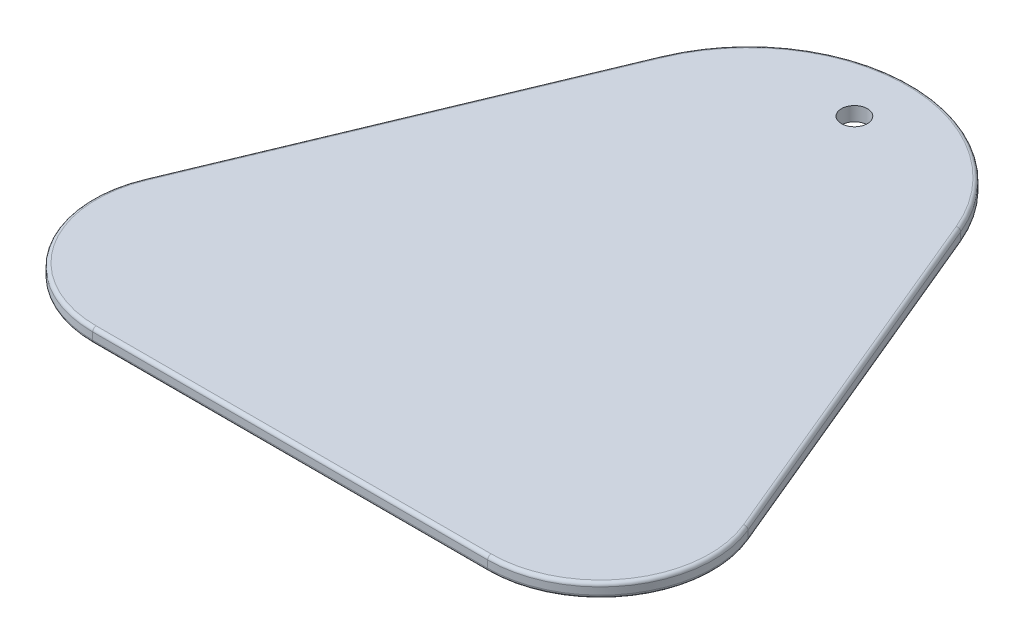
ISO-10303-21;
HEADER;
FILE_DESCRIPTION(('STEP AP214'),'2;1');
FILE_NAME('part.step','',(''),(''),'','','');
FILE_SCHEMA(('AUTOMOTIVE_DESIGN { 1 0 10303 214 1 1 1 1 }'));
ENDSEC;
DATA;
#1=APPLICATION_CONTEXT('core data for automotive mechanical design processes');
#2=APPLICATION_PROTOCOL_DEFINITION('international standard','automotive_design',2000,#1);
#3=PRODUCT_CONTEXT('',#1,'mechanical');
#4=PRODUCT('Part','Part','',(#3));
#5=PRODUCT_RELATED_PRODUCT_CATEGORY('part','',(#4));
#6=PRODUCT_DEFINITION_FORMATION('','',#4);
#7=PRODUCT_DEFINITION_CONTEXT('part definition',#1,'design');
#8=PRODUCT_DEFINITION('design','',#6,#7);
#9=PRODUCT_DEFINITION_SHAPE('','',#8);
#10=(LENGTH_UNIT() NAMED_UNIT(*) SI_UNIT(.MILLI.,.METRE.));
#11=(NAMED_UNIT(*) PLANE_ANGLE_UNIT() SI_UNIT($,.RADIAN.));
#12=(NAMED_UNIT(*) SI_UNIT($,.STERADIAN.) SOLID_ANGLE_UNIT());
#13=UNCERTAINTY_MEASURE_WITH_UNIT(LENGTH_MEASURE(1.E-05),#10,'distance_accuracy_value','');
#14=(GEOMETRIC_REPRESENTATION_CONTEXT(3) GLOBAL_UNCERTAINTY_ASSIGNED_CONTEXT((#13)) GLOBAL_UNIT_ASSIGNED_CONTEXT((#10,
#11,#12)) REPRESENTATION_CONTEXT('',''));
#15=CARTESIAN_POINT('',(0.,0.,0.));
#16=DIRECTION('',(0.,0.,1.));
#17=DIRECTION('',(1.,0.,0.));
#18=AXIS2_PLACEMENT_3D('',#15,#16,#17);
#19=CARTESIAN_POINT('',(0.,12.7,-311.15));
#20=DIRECTION('',(0.,1.,0.));
#21=DIRECTION('',(0.,0.,1.));
#22=AXIS2_PLACEMENT_3D('',#19,#20,#21);
#23=PLANE('',#22);
#24=DIRECTION('',(-0.384615384615384,0.,0.923076923076923));
#25=VECTOR('',#24,1.);
#26=CARTESIAN_POINT('',(-268.653846153846,12.7,-37.8557692307693));
#27=LINE('',#26,#25);
#28=CARTESIAN_POINT('',(-131.884615384615,12.7,-366.101923076923));
#29=VERTEX_POINT('',#28);
#30=CARTESIAN_POINT('',(-268.653846153846,12.7,-37.8557692307693));
#31=VERTEX_POINT('',#30);
#32=EDGE_CURVE('E152',#29,#31,#27,.T.);
#33=ORIENTED_EDGE('',*,*,#32,.T.);
#34=CARTESIAN_POINT('',(-177.8,12.7,0.));
#35=DIRECTION('',(0.,1.,0.));
#36=DIRECTION('',(0.,0.,1.));
#37=AXIS2_PLACEMENT_3D('',#34,#35,#36);
#38=CIRCLE('',#37,98.425);
#39=CARTESIAN_POINT('',(-177.8,12.7,98.425));
#40=VERTEX_POINT('',#39);
#41=EDGE_CURVE('E133',#31,#40,#38,.T.);
#42=ORIENTED_EDGE('',*,*,#41,.T.);
#43=DIRECTION('',(1.,0.,0.));
#44=VECTOR('',#43,1.);
#45=CARTESIAN_POINT('',(177.8,12.7,98.425));
#46=LINE('',#45,#44);
#47=CARTESIAN_POINT('',(177.8,12.7,98.425));
#48=VERTEX_POINT('',#47);
#49=EDGE_CURVE('E141',#40,#48,#46,.T.);
#50=ORIENTED_EDGE('',*,*,#49,.T.);
#51=CARTESIAN_POINT('',(177.8,12.7,0.));
#52=DIRECTION('',(0.,1.,0.));
#53=DIRECTION('',(0.,0.,1.));
#54=AXIS2_PLACEMENT_3D('',#51,#52,#53);
#55=CIRCLE('',#54,98.425);
#56=CARTESIAN_POINT('',(268.653846153846,12.7,-37.8557692307692));
#57=VERTEX_POINT('',#56);
#58=EDGE_CURVE('E147',#48,#57,#55,.T.);
#59=ORIENTED_EDGE('',*,*,#58,.T.);
#60=DIRECTION('',(-0.384615384615385,0.,-0.923076923076923));
#61=VECTOR('',#60,1.);
#62=CARTESIAN_POINT('',(131.884615384615,12.7,-366.101923076923));
#63=LINE('',#62,#61);
#64=CARTESIAN_POINT('',(131.884615384615,12.7,-366.101923076923));
#65=VERTEX_POINT('',#64);
#66=EDGE_CURVE('E258',#57,#65,#63,.T.);
#67=ORIENTED_EDGE('',*,*,#66,.T.);
#68=CARTESIAN_POINT('',(0.,12.7,-311.15));
#69=DIRECTION('',(0.,1.,0.));
#70=DIRECTION('',(0.,0.,1.));
#71=AXIS2_PLACEMENT_3D('',#68,#69,#70);
#72=CIRCLE('',#71,142.875);
#73=EDGE_CURVE('E157',#65,#29,#72,.T.);
#74=ORIENTED_EDGE('',*,*,#73,.T.);
#75=EDGE_LOOP('',(#33,#42,#50,#59,#67,#74));
#76=FACE_BOUND('',#75,.T.);
#77=CARTESIAN_POINT('',(0.,12.7,-406.4));
#78=DIRECTION('',(0.,1.,0.));
#79=DIRECTION('',(0.,0.,1.));
#80=AXIS2_PLACEMENT_3D('',#77,#78,#79);
#81=CIRCLE('',#80,11.7094);
#82=CARTESIAN_POINT('',(0.,12.7,-394.6906));
#83=VERTEX_POINT('',#82);
#84=EDGE_CURVE('E277',#83,#83,#81,.T.);
#85=ORIENTED_EDGE('',*,*,#84,.F.);
#86=EDGE_LOOP('',(#85));
#87=FACE_BOUND('',#86,.T.);
#88=ADVANCED_FACE('F37',(#76,#87),#23,.T.);
#89=CARTESIAN_POINT('',(0.,0.,-311.15));
#90=DIRECTION('',(0.,1.,0.));
#91=DIRECTION('',(0.,0.,1.));
#92=AXIS2_PLACEMENT_3D('',#89,#90,#91);
#93=PLANE('',#92);
#94=DIRECTION('',(1.,0.,0.));
#95=VECTOR('',#94,1.);
#96=CARTESIAN_POINT('',(0.,0.,98.425));
#97=LINE('',#96,#95);
#98=CARTESIAN_POINT('',(177.8,0.,98.425));
#99=VERTEX_POINT('',#98);
#100=CARTESIAN_POINT('',(-177.8,0.,98.425));
#101=VERTEX_POINT('',#100);
#102=EDGE_CURVE('E185',#99,#101,#97,.F.);
#103=ORIENTED_EDGE('',*,*,#102,.T.);
#104=CARTESIAN_POINT('',(-177.8,0.,0.));
#105=DIRECTION('',(0.,1.,0.));
#106=DIRECTION('',(0.,0.,1.));
#107=AXIS2_PLACEMENT_3D('',#104,#105,#106);
#108=CIRCLE('',#107,98.425);
#109=CARTESIAN_POINT('',(-268.653846153846,0.,-37.8557692307693));
#110=VERTEX_POINT('',#109);
#111=EDGE_CURVE('E195',#101,#110,#108,.F.);
#112=ORIENTED_EDGE('',*,*,#111,.T.);
#113=DIRECTION('',(-0.384615384615384,0.,0.923076923076923));
#114=VECTOR('',#113,1.);
#115=CARTESIAN_POINT('',(-131.884615384615,0.,-366.101923076923));
#116=LINE('',#115,#114);
#117=CARTESIAN_POINT('',(-131.884615384615,0.,-366.101923076923));
#118=VERTEX_POINT('',#117);
#119=EDGE_CURVE('E193',#110,#118,#116,.F.);
#120=ORIENTED_EDGE('',*,*,#119,.T.);
#121=CARTESIAN_POINT('',(0.,0.,-311.15));
#122=DIRECTION('',(0.,1.,0.));
#123=DIRECTION('',(0.,0.,1.));
#124=AXIS2_PLACEMENT_3D('',#121,#122,#123);
#125=CIRCLE('',#124,142.875);
#126=CARTESIAN_POINT('',(131.884615384615,0.,-366.101923076923));
#127=VERTEX_POINT('',#126);
#128=EDGE_CURVE('E191',#118,#127,#125,.F.);
#129=ORIENTED_EDGE('',*,*,#128,.T.);
#130=DIRECTION('',(-0.384615384615385,0.,-0.923076923076923));
#131=VECTOR('',#130,1.);
#132=CARTESIAN_POINT('',(131.884615384615,0.,-366.101923076923));
#133=LINE('',#132,#131);
#134=CARTESIAN_POINT('',(268.653846153846,0.,-37.8557692307692));
#135=VERTEX_POINT('',#134);
#136=EDGE_CURVE('E189',#127,#135,#133,.F.);
#137=ORIENTED_EDGE('',*,*,#136,.T.);
#138=CARTESIAN_POINT('',(177.8,0.,0.));
#139=DIRECTION('',(0.,1.,0.));
#140=DIRECTION('',(0.,0.,1.));
#141=AXIS2_PLACEMENT_3D('',#138,#139,#140);
#142=CIRCLE('',#141,98.425);
#143=EDGE_CURVE('E187',#135,#99,#142,.F.);
#144=ORIENTED_EDGE('',*,*,#143,.T.);
#145=EDGE_LOOP('',(#103,#112,#120,#129,#137,#144));
#146=FACE_BOUND('',#145,.T.);
#147=CARTESIAN_POINT('',(0.,0.,-406.4));
#148=DIRECTION('',(0.,1.,0.));
#149=DIRECTION('',(0.,0.,1.));
#150=AXIS2_PLACEMENT_3D('',#147,#148,#149);
#151=CIRCLE('',#150,11.7094);
#152=CARTESIAN_POINT('',(0.,0.,-394.6906));
#153=VERTEX_POINT('',#152);
#154=EDGE_CURVE('E182',#153,#153,#151,.T.);
#155=ORIENTED_EDGE('',*,*,#154,.T.);
#156=EDGE_LOOP('',(#155));
#157=FACE_BOUND('',#156,.T.);
#158=ADVANCED_FACE('F230',(#146,#157),#93,.F.);
#159=CARTESIAN_POINT('',(0.,12.7,-311.15));
#160=DIRECTION('',(0.,-1.,0.));
#161=DIRECTION('',(0.,0.,-1.));
#162=AXIS2_PLACEMENT_3D('',#159,#160,#161);
#163=CYLINDRICAL_SURFACE('',#162,146.05);
#164=DIRECTION('',(0.,-1.,0.));
#165=VECTOR('',#164,1.);
#166=CARTESIAN_POINT('',(134.815384615385,12.7,-367.323076923077));
#167=LINE('',#166,#165);
#168=CARTESIAN_POINT('',(134.815384615385,9.525,-367.323076923077));
#169=VERTEX_POINT('',#168);
#170=CARTESIAN_POINT('',(134.815384615385,3.175,-367.323076923077));
#171=VERTEX_POINT('',#170);
#172=EDGE_CURVE('E273',#169,#171,#167,.T.);
#173=ORIENTED_EDGE('',*,*,#172,.T.);
#174=CARTESIAN_POINT('',(0.,3.175,-311.15));
#175=DIRECTION('',(0.,1.,0.));
#176=DIRECTION('',(0.,0.,1.));
#177=AXIS2_PLACEMENT_3D('',#174,#175,#176);
#178=CIRCLE('',#177,146.05);
#179=CARTESIAN_POINT('',(-134.815384615385,3.175,-367.323076923077));
#180=VERTEX_POINT('',#179);
#181=EDGE_CURVE('E200',#171,#180,#178,.T.);
#182=ORIENTED_EDGE('',*,*,#181,.T.);
#183=DIRECTION('',(0.,-1.,0.));
#184=VECTOR('',#183,1.);
#185=CARTESIAN_POINT('',(-134.815384615385,12.7,-367.323076923077));
#186=LINE('',#185,#184);
#187=CARTESIAN_POINT('',(-134.815384615385,9.525,-367.323076923077));
#188=VERTEX_POINT('',#187);
#189=EDGE_CURVE('E148',#188,#180,#186,.T.);
#190=ORIENTED_EDGE('',*,*,#189,.F.);
#191=CARTESIAN_POINT('',(0.,9.525,-311.15));
#192=DIRECTION('',(0.,1.,0.));
#193=DIRECTION('',(0.,0.,1.));
#194=AXIS2_PLACEMENT_3D('',#191,#192,#193);
#195=CIRCLE('',#194,146.05);
#196=EDGE_CURVE('E162',#188,#169,#195,.F.);
#197=ORIENTED_EDGE('',*,*,#196,.T.);
#198=EDGE_LOOP('',(#173,#182,#190,#197));
#199=FACE_BOUND('',#198,.T.);
#200=ADVANCED_FACE('F271',(#199),#163,.T.);
#201=CARTESIAN_POINT('',(-134.815384615385,12.7,-367.323076923077));
#202=DIRECTION('',(0.923076923076923,0.,0.384615384615384));
#203=DIRECTION('',(0.384615384615384,0.,-0.923076923076923));
#204=AXIS2_PLACEMENT_3D('',#201,#202,#203);
#205=PLANE('',#204);
#206=ORIENTED_EDGE('',*,*,#189,.T.);
#207=DIRECTION('',(-0.384615384615384,0.,0.923076923076923));
#208=VECTOR('',#207,1.);
#209=CARTESIAN_POINT('',(-134.815384615385,3.175,-367.323076923077));
#210=LINE('',#209,#208);
#211=CARTESIAN_POINT('',(-271.584615384615,3.175,-39.0769230769231));
#212=VERTEX_POINT('',#211);
#213=EDGE_CURVE('E198',#180,#212,#210,.T.);
#214=ORIENTED_EDGE('',*,*,#213,.T.);
#215=DIRECTION('',(0.,-1.,0.));
#216=VECTOR('',#215,1.);
#217=CARTESIAN_POINT('',(-271.584615384615,12.7,-39.0769230769231));
#218=LINE('',#217,#216);
#219=CARTESIAN_POINT('',(-271.584615384615,9.525,-39.0769230769231));
#220=VERTEX_POINT('',#219);
#221=EDGE_CURVE('E245',#220,#212,#218,.T.);
#222=ORIENTED_EDGE('',*,*,#221,.F.);
#223=DIRECTION('',(-0.384615384615384,0.,0.923076923076923));
#224=VECTOR('',#223,1.);
#225=CARTESIAN_POINT('',(-134.815384615385,9.525,-367.323076923077));
#226=LINE('',#225,#224);
#227=EDGE_CURVE('E155',#220,#188,#226,.F.);
#228=ORIENTED_EDGE('',*,*,#227,.T.);
#229=EDGE_LOOP('',(#206,#214,#222,#228));
#230=FACE_BOUND('',#229,.T.);
#231=ADVANCED_FACE('F244',(#230),#205,.F.);
#232=CARTESIAN_POINT('',(-177.8,12.7,0.));
#233=DIRECTION('',(0.,-1.,0.));
#234=DIRECTION('',(0.,0.,-1.));
#235=AXIS2_PLACEMENT_3D('',#232,#233,#234);
#236=CYLINDRICAL_SURFACE('',#235,101.6);
#237=ORIENTED_EDGE('',*,*,#221,.T.);
#238=CARTESIAN_POINT('',(-177.8,3.175,0.));
#239=DIRECTION('',(0.,1.,0.));
#240=DIRECTION('',(0.,0.,1.));
#241=AXIS2_PLACEMENT_3D('',#238,#239,#240);
#242=CIRCLE('',#241,101.6);
#243=CARTESIAN_POINT('',(-177.8,3.175,101.6));
#244=VERTEX_POINT('',#243);
#245=EDGE_CURVE('E169',#212,#244,#242,.T.);
#246=ORIENTED_EDGE('',*,*,#245,.T.);
#247=DIRECTION('',(0.,-1.,0.));
#248=VECTOR('',#247,1.);
#249=CARTESIAN_POINT('',(-177.8,12.7,101.6));
#250=LINE('',#249,#248);
#251=CARTESIAN_POINT('',(-177.8,9.525,101.6));
#252=VERTEX_POINT('',#251);
#253=EDGE_CURVE('E250',#252,#244,#250,.T.);
#254=ORIENTED_EDGE('',*,*,#253,.F.);
#255=CARTESIAN_POINT('',(-177.8,9.525,0.));
#256=DIRECTION('',(0.,1.,0.));
#257=DIRECTION('',(0.,0.,1.));
#258=AXIS2_PLACEMENT_3D('',#255,#256,#257);
#259=CIRCLE('',#258,101.6);
#260=EDGE_CURVE('E135',#252,#220,#259,.F.);
#261=ORIENTED_EDGE('',*,*,#260,.T.);
#262=EDGE_LOOP('',(#237,#246,#254,#261));
#263=FACE_BOUND('',#262,.T.);
#264=ADVANCED_FACE('F248',(#263),#236,.T.);
#265=CARTESIAN_POINT('',(-177.8,12.7,101.6));
#266=DIRECTION('',(0.,0.,-1.));
#267=DIRECTION('',(-1.,0.,0.));
#268=AXIS2_PLACEMENT_3D('',#265,#266,#267);
#269=PLANE('',#268);
#270=ORIENTED_EDGE('',*,*,#253,.T.);
#271=DIRECTION('',(1.,0.,0.));
#272=VECTOR('',#271,1.);
#273=CARTESIAN_POINT('',(-177.8,3.175,101.6));
#274=LINE('',#273,#272);
#275=CARTESIAN_POINT('',(177.8,3.175,101.6));
#276=VERTEX_POINT('',#275);
#277=EDGE_CURVE('E11',#244,#276,#274,.T.);
#278=ORIENTED_EDGE('',*,*,#277,.T.);
#279=DIRECTION('',(0.,-1.,0.));
#280=VECTOR('',#279,1.);
#281=CARTESIAN_POINT('',(177.8,12.7,101.6));
#282=LINE('',#281,#280);
#283=CARTESIAN_POINT('',(177.8,9.525,101.6));
#284=VERTEX_POINT('',#283);
#285=EDGE_CURVE('E253',#284,#276,#282,.T.);
#286=ORIENTED_EDGE('',*,*,#285,.F.);
#287=DIRECTION('',(1.,0.,0.));
#288=VECTOR('',#287,1.);
#289=CARTESIAN_POINT('',(-177.8,9.525,101.6));
#290=LINE('',#289,#288);
#291=EDGE_CURVE('E168',#284,#252,#290,.F.);
#292=ORIENTED_EDGE('',*,*,#291,.T.);
#293=EDGE_LOOP('',(#270,#278,#286,#292));
#294=FACE_BOUND('',#293,.T.);
#295=ADVANCED_FACE('F313',(#294),#269,.F.);
#296=CARTESIAN_POINT('',(177.8,12.7,0.));
#297=DIRECTION('',(0.,-1.,0.));
#298=DIRECTION('',(0.,0.,-1.));
#299=AXIS2_PLACEMENT_3D('',#296,#297,#298);
#300=CYLINDRICAL_SURFACE('',#299,101.6);
#301=ORIENTED_EDGE('',*,*,#285,.T.);
#302=CARTESIAN_POINT('',(177.8,3.175,0.));
#303=DIRECTION('',(0.,1.,0.));
#304=DIRECTION('',(0.,0.,1.));
#305=AXIS2_PLACEMENT_3D('',#302,#303,#304);
#306=CIRCLE('',#305,101.6);
#307=CARTESIAN_POINT('',(271.584615384615,3.175,-39.0769230769231));
#308=VERTEX_POINT('',#307);
#309=EDGE_CURVE('E46',#276,#308,#306,.T.);
#310=ORIENTED_EDGE('',*,*,#309,.T.);
#311=DIRECTION('',(0.,-1.,0.));
#312=VECTOR('',#311,1.);
#313=CARTESIAN_POINT('',(271.584615384615,12.7,-39.0769230769231));
#314=LINE('',#313,#312);
#315=CARTESIAN_POINT('',(271.584615384615,9.525,-39.0769230769231));
#316=VERTEX_POINT('',#315);
#317=EDGE_CURVE('E276',#316,#308,#314,.T.);
#318=ORIENTED_EDGE('',*,*,#317,.F.);
#319=CARTESIAN_POINT('',(177.8,9.525,0.));
#320=DIRECTION('',(0.,1.,0.));
#321=DIRECTION('',(0.,0.,1.));
#322=AXIS2_PLACEMENT_3D('',#319,#320,#321);
#323=CIRCLE('',#322,101.6);
#324=EDGE_CURVE('E166',#316,#284,#323,.F.);
#325=ORIENTED_EDGE('',*,*,#324,.T.);
#326=EDGE_LOOP('',(#301,#310,#318,#325));
#327=FACE_BOUND('',#326,.T.);
#328=ADVANCED_FACE('F283',(#327),#300,.T.);
#329=CARTESIAN_POINT('',(134.815384615385,12.7,-367.323076923077));
#330=DIRECTION('',(-0.923076923076923,0.,0.384615384615385));
#331=DIRECTION('',(0.384615384615385,0.,0.923076923076923));
#332=AXIS2_PLACEMENT_3D('',#329,#330,#331);
#333=PLANE('',#332);
#334=ORIENTED_EDGE('',*,*,#317,.T.);
#335=DIRECTION('',(-0.384615384615385,0.,-0.923076923076923));
#336=VECTOR('',#335,1.);
#337=CARTESIAN_POINT('',(134.815384615385,3.175,-367.323076923077));
#338=LINE('',#337,#336);
#339=EDGE_CURVE('E202',#308,#171,#338,.T.);
#340=ORIENTED_EDGE('',*,*,#339,.T.);
#341=ORIENTED_EDGE('',*,*,#172,.F.);
#342=DIRECTION('',(-0.384615384615385,0.,-0.923076923076923));
#343=VECTOR('',#342,1.);
#344=CARTESIAN_POINT('',(271.584615384615,9.525,-39.0769230769231));
#345=LINE('',#344,#343);
#346=EDGE_CURVE('E164',#169,#316,#345,.F.);
#347=ORIENTED_EDGE('',*,*,#346,.T.);
#348=EDGE_LOOP('',(#334,#340,#341,#347));
#349=FACE_BOUND('',#348,.T.);
#350=ADVANCED_FACE('F308',(#349),#333,.F.);
#351=CARTESIAN_POINT('',(0.,12.7,-406.4));
#352=DIRECTION('',(0.,-1.,0.));
#353=DIRECTION('',(0.,0.,-1.));
#354=AXIS2_PLACEMENT_3D('',#351,#352,#353);
#355=CYLINDRICAL_SURFACE('',#354,11.7094);
#356=ORIENTED_EDGE('',*,*,#84,.T.);
#357=EDGE_LOOP('',(#356));
#358=FACE_BOUND('',#357,.T.);
#359=ORIENTED_EDGE('',*,*,#154,.F.);
#360=EDGE_LOOP('',(#359));
#361=FACE_BOUND('',#360,.T.);
#362=ADVANCED_FACE('F306',(#358,#361),#355,.F.);
#363=CARTESIAN_POINT('',(131.884615384615,9.525,-366.101923076923));
#364=DIRECTION('',(0.384615384615385,0.,0.923076923076923));
#365=DIRECTION('',(0.923076923076923,0.,-0.384615384615385));
#366=AXIS2_PLACEMENT_3D('',#363,#364,#365);
#367=CYLINDRICAL_SURFACE('',#366,3.175);
#368=CARTESIAN_POINT('',(268.653846153846,9.525,-37.8557692307692));
#369=DIRECTION('',(0.384615384615383,0.,0.923076923076924));
#370=DIRECTION('',(0.923076923076924,0.,-0.384615384615383));
#371=AXIS2_PLACEMENT_3D('',#368,#369,#370);
#372=CIRCLE('',#371,3.175);
#373=EDGE_CURVE('E176',#316,#57,#372,.T.);
#374=ORIENTED_EDGE('',*,*,#373,.F.);
#375=ORIENTED_EDGE('',*,*,#346,.F.);
#376=CARTESIAN_POINT('',(131.884615384615,9.525,-366.101923076923));
#377=DIRECTION('',(-0.384615384615383,0.,-0.923076923076924));
#378=DIRECTION('',(-0.923076923076924,0.,0.384615384615383));
#379=AXIS2_PLACEMENT_3D('',#376,#377,#378);
#380=CIRCLE('',#379,3.175);
#381=EDGE_CURVE('E179',#65,#169,#380,.T.);
#382=ORIENTED_EDGE('',*,*,#381,.F.);
#383=ORIENTED_EDGE('',*,*,#66,.F.);
#384=EDGE_LOOP('',(#374,#375,#382,#383));
#385=FACE_BOUND('',#384,.T.);
#386=ADVANCED_FACE('F333',(#385),#367,.T.);
#387=CARTESIAN_POINT('',(0.,9.525,-311.15));
#388=DIRECTION('',(0.,1.,0.));
#389=DIRECTION('',(0.,0.,1.));
#390=AXIS2_PLACEMENT_3D('',#387,#388,#389);
#391=TOROIDAL_SURFACE('',#390,142.875,3.175);
#392=ORIENTED_EDGE('',*,*,#381,.T.);
#393=ORIENTED_EDGE('',*,*,#196,.F.);
#394=CARTESIAN_POINT('',(-131.884615384615,9.525,-366.101923076923));
#395=DIRECTION('',(-0.384615384615377,0.,0.923076923076926));
#396=DIRECTION('',(0.923076923076926,0.,0.384615384615377));
#397=AXIS2_PLACEMENT_3D('',#394,#395,#396);
#398=CIRCLE('',#397,3.175);
#399=EDGE_CURVE('E173',#29,#188,#398,.T.);
#400=ORIENTED_EDGE('',*,*,#399,.F.);
#401=ORIENTED_EDGE('',*,*,#73,.F.);
#402=EDGE_LOOP('',(#392,#393,#400,#401));
#403=FACE_BOUND('',#402,.T.);
#404=ADVANCED_FACE('F265',(#403),#391,.T.);
#405=CARTESIAN_POINT('',(177.8,9.525,0.));
#406=DIRECTION('',(0.,1.,0.));
#407=DIRECTION('',(0.,0.,1.));
#408=AXIS2_PLACEMENT_3D('',#405,#406,#407);
#409=TOROIDAL_SURFACE('',#408,98.425,3.175);
#410=ORIENTED_EDGE('',*,*,#373,.T.);
#411=ORIENTED_EDGE('',*,*,#58,.F.);
#412=CARTESIAN_POINT('',(177.8,9.525,98.425));
#413=DIRECTION('',(-1.,0.,0.));
#414=DIRECTION('',(0.,0.,1.));
#415=AXIS2_PLACEMENT_3D('',#412,#413,#414);
#416=CIRCLE('',#415,3.175);
#417=EDGE_CURVE('E144',#284,#48,#416,.T.);
#418=ORIENTED_EDGE('',*,*,#417,.F.);
#419=ORIENTED_EDGE('',*,*,#324,.F.);
#420=EDGE_LOOP('',(#410,#411,#418,#419));
#421=FACE_BOUND('',#420,.T.);
#422=ADVANCED_FACE('F328',(#421),#409,.T.);
#423=CARTESIAN_POINT('',(-131.884615384615,9.525,-366.101923076923));
#424=DIRECTION('',(0.384615384615384,0.,-0.923076923076923));
#425=DIRECTION('',(-0.923076923076923,0.,-0.384615384615384));
#426=AXIS2_PLACEMENT_3D('',#423,#424,#425);
#427=CYLINDRICAL_SURFACE('',#426,3.175);
#428=ORIENTED_EDGE('',*,*,#399,.T.);
#429=ORIENTED_EDGE('',*,*,#227,.F.);
#430=CARTESIAN_POINT('',(-268.653846153846,9.525,-37.8557692307693));
#431=DIRECTION('',(-0.384615384615387,0.,0.923076923076922));
#432=DIRECTION('',(0.923076923076922,0.,0.384615384615387));
#433=AXIS2_PLACEMENT_3D('',#430,#431,#432);
#434=CIRCLE('',#433,3.175);
#435=EDGE_CURVE('E138',#31,#220,#434,.T.);
#436=ORIENTED_EDGE('',*,*,#435,.F.);
#437=ORIENTED_EDGE('',*,*,#32,.F.);
#438=EDGE_LOOP('',(#428,#429,#436,#437));
#439=FACE_BOUND('',#438,.T.);
#440=ADVANCED_FACE('F268',(#439),#427,.T.);
#441=CARTESIAN_POINT('',(0.,9.525,98.425));
#442=DIRECTION('',(-1.,0.,0.));
#443=DIRECTION('',(0.,0.,1.));
#444=AXIS2_PLACEMENT_3D('',#441,#442,#443);
#445=CYLINDRICAL_SURFACE('',#444,3.175);
#446=ORIENTED_EDGE('',*,*,#417,.T.);
#447=ORIENTED_EDGE('',*,*,#49,.F.);
#448=CARTESIAN_POINT('',(-177.8,9.525,98.425));
#449=DIRECTION('',(-1.,0.,0.));
#450=DIRECTION('',(0.,0.,1.));
#451=AXIS2_PLACEMENT_3D('',#448,#449,#450);
#452=CIRCLE('',#451,3.175);
#453=EDGE_CURVE('E129',#252,#40,#452,.T.);
#454=ORIENTED_EDGE('',*,*,#453,.F.);
#455=ORIENTED_EDGE('',*,*,#291,.F.);
#456=EDGE_LOOP('',(#446,#447,#454,#455));
#457=FACE_BOUND('',#456,.T.);
#458=ADVANCED_FACE('F142',(#457),#445,.T.);
#459=CARTESIAN_POINT('',(-177.8,9.525,0.));
#460=DIRECTION('',(0.,1.,0.));
#461=DIRECTION('',(0.,0.,1.));
#462=AXIS2_PLACEMENT_3D('',#459,#460,#461);
#463=TOROIDAL_SURFACE('',#462,98.425,3.175);
#464=ORIENTED_EDGE('',*,*,#435,.T.);
#465=ORIENTED_EDGE('',*,*,#260,.F.);
#466=ORIENTED_EDGE('',*,*,#453,.T.);
#467=ORIENTED_EDGE('',*,*,#41,.F.);
#468=EDGE_LOOP('',(#464,#465,#466,#467));
#469=FACE_BOUND('',#468,.T.);
#470=ADVANCED_FACE('F131',(#469),#463,.T.);
#471=CARTESIAN_POINT('',(131.884615384615,3.175,-366.101923076923));
#472=DIRECTION('',(-0.384615384615385,0.,-0.923076923076923));
#473=DIRECTION('',(-0.923076923076923,0.,0.384615384615385));
#474=AXIS2_PLACEMENT_3D('',#471,#472,#473);
#475=CYLINDRICAL_SURFACE('',#474,3.175);
#476=CARTESIAN_POINT('',(268.653846153846,3.175,-37.8557692307692));
#477=DIRECTION('',(0.384615384615385,0.,0.923076923076923));
#478=DIRECTION('',(0.923076923076923,0.,-0.384615384615385));
#479=AXIS2_PLACEMENT_3D('',#476,#477,#478);
#480=CIRCLE('',#479,3.175);
#481=EDGE_CURVE('E214',#135,#308,#480,.T.);
#482=ORIENTED_EDGE('',*,*,#481,.F.);
#483=ORIENTED_EDGE('',*,*,#136,.F.);
#484=CARTESIAN_POINT('',(131.884615384615,3.175,-366.101923076923));
#485=DIRECTION('',(-0.384615384615383,0.,-0.923076923076924));
#486=DIRECTION('',(-0.923076923076924,0.,0.384615384615383));
#487=AXIS2_PLACEMENT_3D('',#484,#485,#486);
#488=CIRCLE('',#487,3.175);
#489=EDGE_CURVE('E41',#171,#127,#488,.T.);
#490=ORIENTED_EDGE('',*,*,#489,.F.);
#491=ORIENTED_EDGE('',*,*,#339,.F.);
#492=EDGE_LOOP('',(#482,#483,#490,#491));
#493=FACE_BOUND('',#492,.T.);
#494=ADVANCED_FACE('F39',(#493),#475,.T.);
#495=CARTESIAN_POINT('',(0.,3.175,-311.15));
#496=DIRECTION('',(0.,1.,0.));
#497=DIRECTION('',(0.,0.,1.));
#498=AXIS2_PLACEMENT_3D('',#495,#496,#497);
#499=TOROIDAL_SURFACE('',#498,142.875,3.175);
#500=ORIENTED_EDGE('',*,*,#489,.T.);
#501=ORIENTED_EDGE('',*,*,#128,.F.);
#502=CARTESIAN_POINT('',(-131.884615384616,3.175,-366.101923076923));
#503=DIRECTION('',(-0.384615384615383,0.,0.923076923076924));
#504=DIRECTION('',(0.923076923076924,0.,0.384615384615383));
#505=AXIS2_PLACEMENT_3D('',#502,#503,#504);
#506=CIRCLE('',#505,3.175);
#507=EDGE_CURVE('E212',#180,#118,#506,.T.);
#508=ORIENTED_EDGE('',*,*,#507,.F.);
#509=ORIENTED_EDGE('',*,*,#181,.F.);
#510=EDGE_LOOP('',(#500,#501,#508,#509));
#511=FACE_BOUND('',#510,.T.);
#512=ADVANCED_FACE('F224',(#511),#499,.T.);
#513=CARTESIAN_POINT('',(177.8,3.175,0.));
#514=DIRECTION('',(0.,1.,0.));
#515=DIRECTION('',(0.,0.,1.));
#516=AXIS2_PLACEMENT_3D('',#513,#514,#515);
#517=TOROIDAL_SURFACE('',#516,98.425,3.175);
#518=ORIENTED_EDGE('',*,*,#481,.T.);
#519=ORIENTED_EDGE('',*,*,#309,.F.);
#520=CARTESIAN_POINT('',(177.8,3.175,98.425));
#521=DIRECTION('',(-1.,0.,0.));
#522=DIRECTION('',(0.,0.,1.));
#523=AXIS2_PLACEMENT_3D('',#520,#521,#522);
#524=CIRCLE('',#523,3.175);
#525=EDGE_CURVE('E209',#99,#276,#524,.T.);
#526=ORIENTED_EDGE('',*,*,#525,.F.);
#527=ORIENTED_EDGE('',*,*,#143,.F.);
#528=EDGE_LOOP('',(#518,#519,#526,#527));
#529=FACE_BOUND('',#528,.T.);
#530=ADVANCED_FACE('F285',(#529),#517,.T.);
#531=CARTESIAN_POINT('',(-131.884615384616,3.175,-366.101923076923));
#532=DIRECTION('',(-0.384615384615384,0.,0.923076923076923));
#533=DIRECTION('',(0.923076923076923,0.,0.384615384615384));
#534=AXIS2_PLACEMENT_3D('',#531,#532,#533);
#535=CYLINDRICAL_SURFACE('',#534,3.175);
#536=ORIENTED_EDGE('',*,*,#507,.T.);
#537=ORIENTED_EDGE('',*,*,#119,.F.);
#538=CARTESIAN_POINT('',(-268.653846153846,3.175,-37.8557692307693));
#539=DIRECTION('',(-0.384615384615383,0.,0.923076923076923));
#540=DIRECTION('',(0.923076923076924,0.,0.384615384615383));
#541=AXIS2_PLACEMENT_3D('',#538,#539,#540);
#542=CIRCLE('',#541,3.175);
#543=EDGE_CURVE('E207',#212,#110,#542,.T.);
#544=ORIENTED_EDGE('',*,*,#543,.F.);
#545=ORIENTED_EDGE('',*,*,#213,.F.);
#546=EDGE_LOOP('',(#536,#537,#544,#545));
#547=FACE_BOUND('',#546,.T.);
#548=ADVANCED_FACE('F237',(#547),#535,.T.);
#549=CARTESIAN_POINT('',(-177.8,3.175,98.425));
#550=DIRECTION('',(1.,0.,0.));
#551=DIRECTION('',(0.,0.,-1.));
#552=AXIS2_PLACEMENT_3D('',#549,#550,#551);
#553=CYLINDRICAL_SURFACE('',#552,3.175);
#554=ORIENTED_EDGE('',*,*,#525,.T.);
#555=ORIENTED_EDGE('',*,*,#277,.F.);
#556=CARTESIAN_POINT('',(-177.8,3.175,98.425));
#557=DIRECTION('',(-1.,0.,0.));
#558=DIRECTION('',(0.,0.,1.));
#559=AXIS2_PLACEMENT_3D('',#556,#557,#558);
#560=CIRCLE('',#559,3.175);
#561=EDGE_CURVE('E205',#101,#244,#560,.T.);
#562=ORIENTED_EDGE('',*,*,#561,.F.);
#563=ORIENTED_EDGE('',*,*,#102,.F.);
#564=EDGE_LOOP('',(#554,#555,#562,#563));
#565=FACE_BOUND('',#564,.T.);
#566=ADVANCED_FACE('F288',(#565),#553,.T.);
#567=CARTESIAN_POINT('',(-177.8,3.175,0.));
#568=DIRECTION('',(0.,1.,0.));
#569=DIRECTION('',(0.,0.,1.));
#570=AXIS2_PLACEMENT_3D('',#567,#568,#569);
#571=TOROIDAL_SURFACE('',#570,98.425,3.175);
#572=ORIENTED_EDGE('',*,*,#543,.T.);
#573=ORIENTED_EDGE('',*,*,#111,.F.);
#574=ORIENTED_EDGE('',*,*,#561,.T.);
#575=ORIENTED_EDGE('',*,*,#245,.F.);
#576=EDGE_LOOP('',(#572,#573,#574,#575));
#577=FACE_BOUND('',#576,.T.);
#578=ADVANCED_FACE('F291',(#577),#571,.T.);
#579=CLOSED_SHELL('',(#88,#158,#200,#231,#264,#295,#328,#350,#362,#386,#404,#422,#440,#458,#470,
#494,#512,#530,#548,#566,#578));
#580=MANIFOLD_SOLID_BREP('B2',#579);
#581=ADVANCED_BREP_SHAPE_REPRESENTATION('',(#18,#580),#14);
#582=SHAPE_DEFINITION_REPRESENTATION(#9,#581);
ENDSEC;
END-ISO-10303-21;
